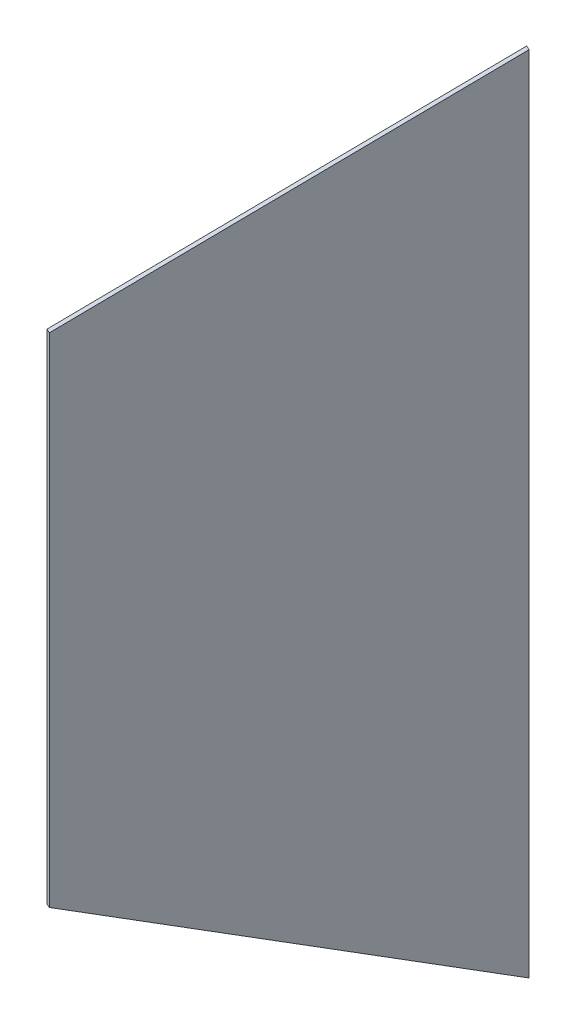
ISO-10303-21;
HEADER;
FILE_DESCRIPTION(('STEP AP214'),'2;1');
FILE_NAME('part.step','',(''),(''),'','','');
FILE_SCHEMA(('AUTOMOTIVE_DESIGN { 1 0 10303 214 1 1 1 1 }'));
ENDSEC;
DATA;
#1=APPLICATION_CONTEXT('core data for automotive mechanical design processes');
#2=APPLICATION_PROTOCOL_DEFINITION('international standard','automotive_design',2000,#1);
#3=PRODUCT_CONTEXT('',#1,'mechanical');
#4=PRODUCT('Part','Part','',(#3));
#5=PRODUCT_RELATED_PRODUCT_CATEGORY('part','',(#4));
#6=PRODUCT_DEFINITION_FORMATION('','',#4);
#7=PRODUCT_DEFINITION_CONTEXT('part definition',#1,'design');
#8=PRODUCT_DEFINITION('design','',#6,#7);
#9=PRODUCT_DEFINITION_SHAPE('','',#8);
#10=(LENGTH_UNIT() NAMED_UNIT(*) SI_UNIT(.MILLI.,.METRE.));
#11=(NAMED_UNIT(*) PLANE_ANGLE_UNIT() SI_UNIT($,.RADIAN.));
#12=(NAMED_UNIT(*) SI_UNIT($,.STERADIAN.) SOLID_ANGLE_UNIT());
#13=UNCERTAINTY_MEASURE_WITH_UNIT(LENGTH_MEASURE(1.E-05),#10,'distance_accuracy_value','');
#14=(GEOMETRIC_REPRESENTATION_CONTEXT(3) GLOBAL_UNCERTAINTY_ASSIGNED_CONTEXT((#13)) GLOBAL_UNIT_ASSIGNED_CONTEXT((#10,
#11,#12)) REPRESENTATION_CONTEXT('',''));
#15=CARTESIAN_POINT('',(0.,0.,0.));
#16=DIRECTION('',(0.,0.,1.));
#17=DIRECTION('',(1.,0.,0.));
#18=AXIS2_PLACEMENT_3D('',#15,#16,#17);
#19=CARTESIAN_POINT('',(450.538093035042,0.,1608.09019848856));
#20=DIRECTION('',(0.913545457642601,0.,0.4067366430758));
#21=DIRECTION('',(0.4067366430758,0.,-0.913545457642601));
#22=AXIS2_PLACEMENT_3D('',#19,#20,#21);
#23=PLANE('',#22);
#24=DIRECTION('',(0.374803377849823,-0.388404251604766,-0.841822169634243));
#25=VECTOR('',#24,1.);
#26=CARTESIAN_POINT('',(346.597140116011,-330.199999999889,1841.54540105952));
#27=LINE('',#26,#25);
#28=CARTESIAN_POINT('',(346.59714011598,-330.199999999972,1841.54540105955));
#29=VERTEX_POINT('',#28);
#30=CARTESIAN_POINT('',(542.681621849697,-533.399999999981,1401.13244429362));
#31=VERTEX_POINT('',#30);
#32=EDGE_CURVE('E57',#29,#31,#27,.T.);
#33=ORIENTED_EDGE('',*,*,#32,.T.);
#34=DIRECTION('',(0.,1.,0.));
#35=VECTOR('',#34,1.);
#36=CARTESIAN_POINT('',(542.681621849724,252.762153421748,1401.13244429364));
#37=LINE('',#36,#35);
#38=CARTESIAN_POINT('',(542.681621849706,533.400000000016,1401.13244429364));
#39=VERTEX_POINT('',#38);
#40=EDGE_CURVE('E19',#31,#39,#37,.T.);
#41=ORIENTED_EDGE('',*,*,#40,.T.);
#42=DIRECTION('',(-0.374803377849823,-0.388404251604766,0.841822169634243));
#43=VECTOR('',#42,1.);
#44=CARTESIAN_POINT('',(542.681621849713,533.400000000065,1401.13244429367));
#45=LINE('',#44,#43);
#46=CARTESIAN_POINT('',(346.597140115973,330.200000000016,1841.54540105956));
#47=VERTEX_POINT('',#46);
#48=EDGE_CURVE('E54',#39,#47,#45,.T.);
#49=ORIENTED_EDGE('',*,*,#48,.T.);
#50=DIRECTION('',(0.,1.,0.));
#51=VECTOR('',#50,1.);
#52=CARTESIAN_POINT('',(346.597140115992,50.4559930574336,1841.54540105957));
#53=LINE('',#52,#51);
#54=EDGE_CURVE('E75',#47,#29,#53,.F.);
#55=ORIENTED_EDGE('',*,*,#54,.T.);
#56=EDGE_LOOP('',(#33,#41,#49,#55));
#57=FACE_BOUND('',#56,.T.);
#58=ADVANCED_FACE('F16',(#57),#23,.T.);
#59=CARTESIAN_POINT('',(542.681621849724,252.762153421748,1401.13244429364));
#60=DIRECTION('',(-0.4067366430758,0.,0.913545457642601));
#61=DIRECTION('',(0.913545457642601,0.,0.4067366430758));
#62=AXIS2_PLACEMENT_3D('',#59,#60,#61);
#63=PLANE('',#62);
#64=ORIENTED_EDGE('',*,*,#40,.F.);
#65=DIRECTION('',(-0.913545457640915,-1.7483827159463E-12,-0.406736643079585));
#66=VECTOR('',#65,1.);
#67=CARTESIAN_POINT('',(542.681621849737,-533.399999999922,1401.13244429361));
#68=LINE('',#67,#66);
#69=CARTESIAN_POINT('',(536.880608193691,-533.399999999983,1398.54966661008));
#70=VERTEX_POINT('',#69);
#71=EDGE_CURVE('E79',#31,#70,#68,.T.);
#72=ORIENTED_EDGE('',*,*,#71,.T.);
#73=DIRECTION('',(0.,1.,0.));
#74=VECTOR('',#73,1.);
#75=CARTESIAN_POINT('',(536.88060819365,0.,1398.54966661006));
#76=LINE('',#75,#74);
#77=CARTESIAN_POINT('',(536.880608193685,533.400000000019,1398.5496666101));
#78=VERTEX_POINT('',#77);
#79=EDGE_CURVE('E72',#70,#78,#76,.T.);
#80=ORIENTED_EDGE('',*,*,#79,.T.);
#81=DIRECTION('',(0.913545457640903,-1.73089888878681E-12,0.406736643079615));
#82=VECTOR('',#81,1.);
#83=CARTESIAN_POINT('',(536.880608193697,533.400000000076,1398.54966661011));
#84=LINE('',#83,#82);
#85=EDGE_CURVE('E62',#78,#39,#84,.T.);
#86=ORIENTED_EDGE('',*,*,#85,.T.);
#87=EDGE_LOOP('',(#64,#72,#80,#86));
#88=FACE_BOUND('',#87,.T.);
#89=ADVANCED_FACE('F71',(#88),#63,.F.);
#90=CARTESIAN_POINT('',(425.1134008383,411.565460630704,1665.19499212761));
#91=DIRECTION('',(0.157978241454102,-0.921489086932309,-0.354824939782604));
#92=DIRECTION('',(0.,0.359337284172584,-0.933207756184801));
#93=AXIS2_PLACEMENT_3D('',#90,#91,#92);
#94=PLANE('',#93);
#95=ORIENTED_EDGE('',*,*,#48,.F.);
#96=ORIENTED_EDGE('',*,*,#85,.F.);
#97=DIRECTION('',(-0.374803377849843,-0.388404251604703,0.841822169634263));
#98=VECTOR('',#97,1.);
#99=CARTESIAN_POINT('',(536.88060819365,533.4,1398.54966661006));
#100=LINE('',#99,#98);
#101=CARTESIAN_POINT('',(340.796126459955,330.200000000021,1838.96262337602));
#102=VERTEX_POINT('',#101);
#103=EDGE_CURVE('E82',#78,#102,#100,.T.);
#104=ORIENTED_EDGE('',*,*,#103,.T.);
#105=DIRECTION('',(-0.913545457642601,0.,-0.4067366430758));
#106=VECTOR('',#105,1.);
#107=CARTESIAN_POINT('',(346.597140115992,330.2,1841.54540105957));
#108=LINE('',#107,#106);
#109=EDGE_CURVE('E68',#102,#47,#108,.F.);
#110=ORIENTED_EDGE('',*,*,#109,.T.);
#111=EDGE_LOOP('',(#95,#96,#104,#110));
#112=FACE_BOUND('',#111,.T.);
#113=ADVANCED_FACE('F65',(#112),#94,.F.);
#114=CARTESIAN_POINT('',(346.597140115992,50.4559930574336,1841.54540105957));
#115=DIRECTION('',(0.4067366430758,0.,-0.913545457642601));
#116=DIRECTION('',(-0.913545457642601,0.,-0.4067366430758));
#117=AXIS2_PLACEMENT_3D('',#114,#115,#116);
#118=PLANE('',#117);
#119=ORIENTED_EDGE('',*,*,#54,.F.);
#120=ORIENTED_EDGE('',*,*,#109,.F.);
#121=DIRECTION('',(0.,1.,0.));
#122=VECTOR('',#121,1.);
#123=CARTESIAN_POINT('',(340.796126459913,0.,1838.96262337598));
#124=LINE('',#123,#122);
#125=CARTESIAN_POINT('',(340.79612645996,-330.199999999975,1838.96262337601));
#126=VERTEX_POINT('',#125);
#127=EDGE_CURVE('E25',#102,#126,#124,.F.);
#128=ORIENTED_EDGE('',*,*,#127,.T.);
#129=DIRECTION('',(0.913545457640914,1.73964080236658E-12,0.406736643079589));
#130=VECTOR('',#129,1.);
#131=CARTESIAN_POINT('',(340.796126459995,-330.1999999999,1838.96262337597));
#132=LINE('',#131,#130);
#133=EDGE_CURVE('E33',#126,#29,#132,.T.);
#134=ORIENTED_EDGE('',*,*,#133,.T.);
#135=EDGE_LOOP('',(#119,#120,#128,#134));
#136=FACE_BOUND('',#135,.T.);
#137=ADVANCED_FACE('F87',(#136),#118,.F.);
#138=CARTESIAN_POINT('',(442.591072796526,-429.67736275811,1625.9394981874));
#139=DIRECTION('',(0.157978241454102,0.921489086932309,-0.354824939782604));
#140=DIRECTION('',(0.,0.359337284172584,0.933207756184801));
#141=AXIS2_PLACEMENT_3D('',#138,#139,#140);
#142=PLANE('',#141);
#143=ORIENTED_EDGE('',*,*,#32,.F.);
#144=ORIENTED_EDGE('',*,*,#133,.F.);
#145=DIRECTION('',(0.374803377849843,-0.388404251604703,-0.841822169634263));
#146=VECTOR('',#145,1.);
#147=CARTESIAN_POINT('',(340.796126459913,-330.2,1838.96262337598));
#148=LINE('',#147,#146);
#149=EDGE_CURVE('E11',#126,#70,#148,.T.);
#150=ORIENTED_EDGE('',*,*,#149,.T.);
#151=ORIENTED_EDGE('',*,*,#71,.F.);
#152=EDGE_LOOP('',(#143,#144,#150,#151));
#153=FACE_BOUND('',#152,.T.);
#154=ADVANCED_FACE('F90',(#153),#142,.F.);
#155=CARTESIAN_POINT('',(444.737079379028,0.,1605.507420805));
#156=DIRECTION('',(0.913545457642601,0.,0.4067366430758));
#157=DIRECTION('',(0.4067366430758,0.,-0.913545457642601));
#158=AXIS2_PLACEMENT_3D('',#155,#156,#157);
#159=PLANE('',#158);
#160=ORIENTED_EDGE('',*,*,#127,.F.);
#161=ORIENTED_EDGE('',*,*,#103,.F.);
#162=ORIENTED_EDGE('',*,*,#79,.F.);
#163=ORIENTED_EDGE('',*,*,#149,.F.);
#164=EDGE_LOOP('',(#160,#161,#162,#163));
#165=FACE_BOUND('',#164,.T.);
#166=ADVANCED_FACE('F89',(#165),#159,.F.);
#167=CLOSED_SHELL('',(#58,#89,#113,#137,#154,#166));
#168=MANIFOLD_SOLID_BREP('B1',#167);
#169=ADVANCED_BREP_SHAPE_REPRESENTATION('',(#18,#168),#14);
#170=SHAPE_DEFINITION_REPRESENTATION(#9,#169);
ENDSEC;
END-ISO-10303-21;
